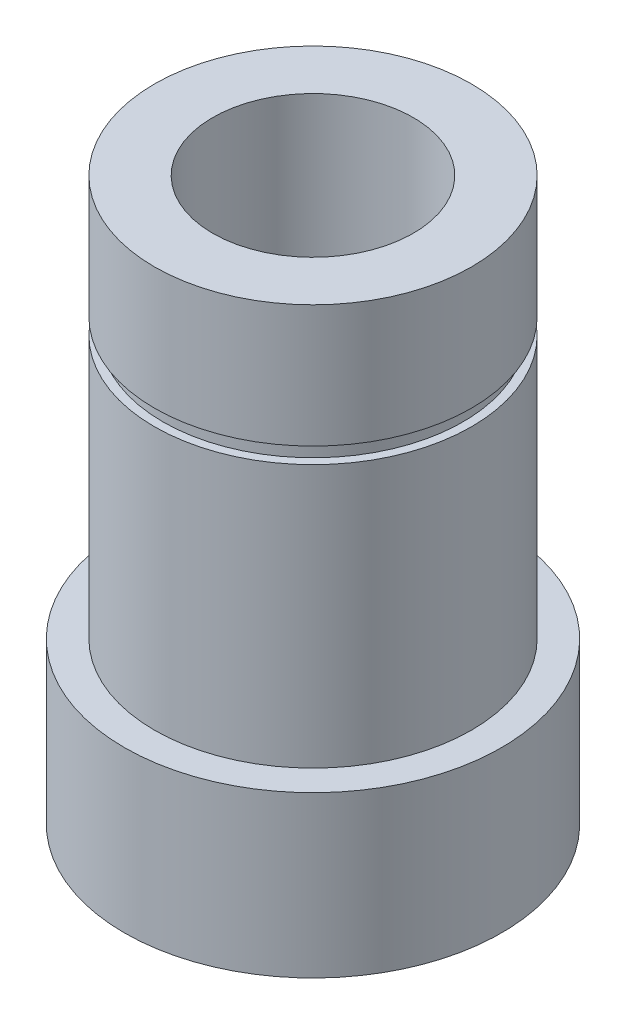
ISO-10303-21;
HEADER;
FILE_DESCRIPTION(('STEP AP214'),'2;1');
FILE_NAME('part.step','',(''),(''),'','','');
FILE_SCHEMA(('AUTOMOTIVE_DESIGN { 1 0 10303 214 1 1 1 1 }'));
ENDSEC;
DATA;
#1=APPLICATION_CONTEXT('core data for automotive mechanical design processes');
#2=APPLICATION_PROTOCOL_DEFINITION('international standard','automotive_design',2000,#1);
#3=PRODUCT_CONTEXT('',#1,'mechanical');
#4=PRODUCT('Part','Part','',(#3));
#5=PRODUCT_RELATED_PRODUCT_CATEGORY('part','',(#4));
#6=PRODUCT_DEFINITION_FORMATION('','',#4);
#7=PRODUCT_DEFINITION_CONTEXT('part definition',#1,'design');
#8=PRODUCT_DEFINITION('design','',#6,#7);
#9=PRODUCT_DEFINITION_SHAPE('','',#8);
#10=(LENGTH_UNIT() NAMED_UNIT(*) SI_UNIT(.MILLI.,.METRE.));
#11=(NAMED_UNIT(*) PLANE_ANGLE_UNIT() SI_UNIT($,.RADIAN.));
#12=(NAMED_UNIT(*) SI_UNIT($,.STERADIAN.) SOLID_ANGLE_UNIT());
#13=UNCERTAINTY_MEASURE_WITH_UNIT(LENGTH_MEASURE(1.E-05),#10,'distance_accuracy_value','');
#14=(GEOMETRIC_REPRESENTATION_CONTEXT(3) GLOBAL_UNCERTAINTY_ASSIGNED_CONTEXT((#13)) GLOBAL_UNIT_ASSIGNED_CONTEXT((#10,
#11,#12)) REPRESENTATION_CONTEXT('',''));
#15=CARTESIAN_POINT('',(0.,0.,0.));
#16=DIRECTION('',(0.,0.,1.));
#17=DIRECTION('',(1.,0.,0.));
#18=AXIS2_PLACEMENT_3D('',#15,#16,#17);
#19=CARTESIAN_POINT('',(0.,10.5,0.));
#20=DIRECTION('',(0.,-1.,0.));
#21=DIRECTION('',(0.,0.,-1.));
#22=AXIS2_PLACEMENT_3D('',#19,#20,#21);
#23=CYLINDRICAL_SURFACE('',#22,3.95);
#24=CARTESIAN_POINT('',(0.,4.,0.));
#25=DIRECTION('',(0.,1.,0.));
#26=DIRECTION('',(0.,0.,1.));
#27=AXIS2_PLACEMENT_3D('',#24,#25,#26);
#28=CIRCLE('',#27,3.95);
#29=CARTESIAN_POINT('',(0.,4.,-3.95));
#30=VERTEX_POINT('',#29);
#31=EDGE_CURVE('E45',#30,#30,#28,.T.);
#32=CARTESIAN_POINT('',(0.,10.55,0.));
#33=DIRECTION('',(0.,1.,0.));
#34=DIRECTION('',(0.,0.,1.));
#35=AXIS2_PLACEMENT_3D('',#32,#33,#34);
#36=CIRCLE('',#35,3.95);
#37=CARTESIAN_POINT('',(0.,10.55,-3.95));
#38=VERTEX_POINT('',#37);
#39=EDGE_CURVE('E49',#38,#38,#36,.T.);
#40=CARTESIAN_POINT('',(0.,4.,-3.95));
#41=CARTESIAN_POINT('',(0.,4.06822916666667,-3.95));
#42=CARTESIAN_POINT('',(0.,4.13645833333333,-3.95));
#43=CARTESIAN_POINT('',(0.,4.27291666666667,-3.95));
#44=CARTESIAN_POINT('',(0.,4.34114583333333,-3.95));
#45=CARTESIAN_POINT('',(0.,4.47760416666667,-3.95));
#46=CARTESIAN_POINT('',(0.,4.54583333333333,-3.95));
#47=CARTESIAN_POINT('',(0.,4.68229166666667,-3.95));
#48=CARTESIAN_POINT('',(0.,4.75052083333333,-3.95));
#49=CARTESIAN_POINT('',(0.,4.88697916666667,-3.95));
#50=CARTESIAN_POINT('',(0.,4.95520833333333,-3.95));
#51=CARTESIAN_POINT('',(0.,5.09166666666667,-3.95));
#52=CARTESIAN_POINT('',(0.,5.15989583333333,-3.95));
#53=CARTESIAN_POINT('',(0.,5.29635416666667,-3.95));
#54=CARTESIAN_POINT('',(0.,5.36458333333333,-3.95));
#55=CARTESIAN_POINT('',(0.,5.50104166666667,-3.95));
#56=CARTESIAN_POINT('',(0.,5.56927083333333,-3.95));
#57=CARTESIAN_POINT('',(0.,5.70572916666667,-3.95));
#58=CARTESIAN_POINT('',(0.,5.77395833333333,-3.95));
#59=CARTESIAN_POINT('',(0.,5.91041666666667,-3.95));
#60=CARTESIAN_POINT('',(0.,5.97864583333333,-3.95));
#61=CARTESIAN_POINT('',(0.,6.11510416666667,-3.95));
#62=CARTESIAN_POINT('',(0.,6.18333333333333,-3.95));
#63=CARTESIAN_POINT('',(0.,6.31979166666667,-3.95));
#64=CARTESIAN_POINT('',(0.,6.38802083333333,-3.95));
#65=CARTESIAN_POINT('',(0.,6.52447916666667,-3.95));
#66=CARTESIAN_POINT('',(0.,6.59270833333333,-3.95));
#67=CARTESIAN_POINT('',(0.,6.72916666666667,-3.95));
#68=CARTESIAN_POINT('',(0.,6.79739583333333,-3.95));
#69=CARTESIAN_POINT('',(0.,6.93385416666667,-3.95));
#70=CARTESIAN_POINT('',(0.,7.00208333333333,-3.95));
#71=CARTESIAN_POINT('',(0.,7.13854166666667,-3.95));
#72=CARTESIAN_POINT('',(0.,7.20677083333333,-3.95));
#73=CARTESIAN_POINT('',(0.,7.34322916666667,-3.95));
#74=CARTESIAN_POINT('',(0.,7.41145833333333,-3.95));
#75=CARTESIAN_POINT('',(0.,7.54791666666667,-3.95));
#76=CARTESIAN_POINT('',(0.,7.61614583333333,-3.95));
#77=CARTESIAN_POINT('',(0.,7.75260416666667,-3.95));
#78=CARTESIAN_POINT('',(0.,7.82083333333333,-3.95));
#79=CARTESIAN_POINT('',(0.,7.95729166666667,-3.95));
#80=CARTESIAN_POINT('',(0.,8.02552083333333,-3.95));
#81=CARTESIAN_POINT('',(0.,8.16197916666667,-3.95));
#82=CARTESIAN_POINT('',(0.,8.23020833333333,-3.95));
#83=CARTESIAN_POINT('',(0.,8.36666666666667,-3.95));
#84=CARTESIAN_POINT('',(0.,8.43489583333333,-3.95));
#85=CARTESIAN_POINT('',(0.,8.57135416666667,-3.95));
#86=CARTESIAN_POINT('',(0.,8.63958333333333,-3.95));
#87=CARTESIAN_POINT('',(0.,8.77604166666667,-3.95));
#88=CARTESIAN_POINT('',(0.,8.84427083333333,-3.95));
#89=CARTESIAN_POINT('',(0.,8.98072916666667,-3.95));
#90=CARTESIAN_POINT('',(0.,9.04895833333333,-3.95));
#91=CARTESIAN_POINT('',(0.,9.18541666666667,-3.95));
#92=CARTESIAN_POINT('',(0.,9.25364583333333,-3.95));
#93=CARTESIAN_POINT('',(0.,9.39010416666667,-3.95));
#94=CARTESIAN_POINT('',(0.,9.45833333333333,-3.95));
#95=CARTESIAN_POINT('',(0.,9.59479166666667,-3.95));
#96=CARTESIAN_POINT('',(0.,9.66302083333333,-3.95));
#97=CARTESIAN_POINT('',(0.,9.79947916666667,-3.95));
#98=CARTESIAN_POINT('',(0.,9.86770833333333,-3.95));
#99=CARTESIAN_POINT('',(0.,10.0041666666667,-3.95));
#100=CARTESIAN_POINT('',(0.,10.0723958333333,-3.95));
#101=CARTESIAN_POINT('',(0.,10.2088541666667,-3.95));
#102=CARTESIAN_POINT('',(0.,10.2770833333333,-3.95));
#103=CARTESIAN_POINT('',(0.,10.4135416666667,-3.95));
#104=CARTESIAN_POINT('',(0.,10.4817708333333,-3.95));
#105=CARTESIAN_POINT('',(0.,10.55,-3.95));
#106=B_SPLINE_CURVE_WITH_KNOTS('',3,(#40,#41,#42,#43,#44,#45,#46,#47,#48,#49,#50,#51,#52,#53,
#54,#55,#56,#57,#58,#59,#60,#61,#62,#63,#64,#65,#66,#67,#68,#69,#70,#71,#72,#73,#74,#75,#76,#77,
#78,#79,#80,#81,#82,#83,#84,#85,#86,#87,#88,#89,#90,#91,#92,#93,#94,#95,#96,#97,#98,#99,#100,
#101,#102,#103,#104,#105),.UNSPECIFIED.,.F.,.F.,(4,2,2,2,2,2,2,2,2,2,2,2,2,2,2,2,2,2,2,2,2,2,2,
2,2,2,2,2,2,2,2,2,4),(0.,0.2046875,0.409375,0.6140625,0.81875,1.0234375,1.228125,1.4328125,
1.6375,1.8421875,2.046875,2.2515625,2.45625,2.6609375,2.865625,3.0703125,3.275,3.4796875,
3.684375,3.8890625,4.09375,4.2984375,4.503125,4.7078125,4.9125,5.1171875,5.321875,5.5265625,
5.73125,5.9359375,6.140625,6.3453125,6.55),.UNSPECIFIED.);
#107=EDGE_CURVE('BSEAM32',#30,#38,#106,.T.);
#108=ORIENTED_EDGE('',*,*,#31,.T.);
#109=ORIENTED_EDGE('',*,*,#39,.F.);
#110=ORIENTED_EDGE('',*,*,#107,.T.);
#111=ORIENTED_EDGE('',*,*,#107,.F.);
#112=EDGE_LOOP('',(#108,#110,#109,#111));
#113=FACE_BOUND('',#112,.T.);
#114=ADVANCED_FACE('F32',(#113),#23,.T.);
#115=CARTESIAN_POINT('',(0.,4.,0.));
#116=DIRECTION('',(0.,-1.,0.));
#117=DIRECTION('',(0.,0.,-1.));
#118=AXIS2_PLACEMENT_3D('',#115,#116,#117);
#119=CYLINDRICAL_SURFACE('',#118,4.7);
#120=CARTESIAN_POINT('',(0.,4.,0.));
#121=DIRECTION('',(0.,1.,0.));
#122=DIRECTION('',(0.,0.,1.));
#123=AXIS2_PLACEMENT_3D('',#120,#121,#122);
#124=CIRCLE('',#123,4.7);
#125=CARTESIAN_POINT('',(0.,4.,4.7));
#126=VERTEX_POINT('',#125);
#127=EDGE_CURVE('E11',#126,#126,#124,.T.);
#128=ORIENTED_EDGE('',*,*,#127,.F.);
#129=EDGE_LOOP('',(#128));
#130=FACE_BOUND('',#129,.T.);
#131=CARTESIAN_POINT('',(0.,0.,0.));
#132=DIRECTION('',(0.,1.,0.));
#133=DIRECTION('',(0.,0.,1.));
#134=AXIS2_PLACEMENT_3D('',#131,#132,#133);
#135=CIRCLE('',#134,4.7);
#136=CARTESIAN_POINT('',(0.,0.,4.7));
#137=VERTEX_POINT('',#136);
#138=EDGE_CURVE('E40',#137,#137,#135,.T.);
#139=ORIENTED_EDGE('',*,*,#138,.T.);
#140=EDGE_LOOP('',(#139));
#141=FACE_BOUND('',#140,.T.);
#142=ADVANCED_FACE('F34',(#130,#141),#119,.T.);
#143=CARTESIAN_POINT('',(0.,4.,0.));
#144=DIRECTION('',(0.,1.,0.));
#145=DIRECTION('',(0.,0.,1.));
#146=AXIS2_PLACEMENT_3D('',#143,#144,#145);
#147=PLANE('',#146);
#148=ORIENTED_EDGE('',*,*,#31,.F.);
#149=EDGE_LOOP('',(#148));
#150=FACE_BOUND('',#149,.T.);
#151=ORIENTED_EDGE('',*,*,#127,.T.);
#152=EDGE_LOOP('',(#151));
#153=FACE_BOUND('',#152,.T.);
#154=ADVANCED_FACE('F77',(#150,#153),#147,.T.);
#155=CARTESIAN_POINT('',(0.,0.,0.));
#156=DIRECTION('',(0.,1.,0.));
#157=DIRECTION('',(0.,0.,1.));
#158=AXIS2_PLACEMENT_3D('',#155,#156,#157);
#159=PLANE('',#158);
#160=CARTESIAN_POINT('',(0.,0.,0.));
#161=DIRECTION('',(0.,1.,0.));
#162=DIRECTION('',(0.,0.,1.));
#163=AXIS2_PLACEMENT_3D('',#160,#161,#162);
#164=CIRCLE('',#163,2.5);
#165=CARTESIAN_POINT('',(0.,0.,2.5));
#166=VERTEX_POINT('',#165);
#167=EDGE_CURVE('E64',#166,#166,#164,.T.);
#168=ORIENTED_EDGE('',*,*,#167,.T.);
#169=EDGE_LOOP('',(#168));
#170=FACE_BOUND('',#169,.T.);
#171=ORIENTED_EDGE('',*,*,#138,.F.);
#172=EDGE_LOOP('',(#171));
#173=FACE_BOUND('',#172,.T.);
#174=ADVANCED_FACE('F79',(#170,#173),#159,.F.);
#175=CARTESIAN_POINT('',(0.,10.95,0.));
#176=DIRECTION('',(0.,1.,0.));
#177=DIRECTION('',(0.,0.,1.));
#178=AXIS2_PLACEMENT_3D('',#175,#176,#177);
#179=CIRCLE('',#178,3.95);
#180=CARTESIAN_POINT('',(0.,10.95,-3.95));
#181=VERTEX_POINT('',#180);
#182=EDGE_CURVE('E36',#181,#181,#179,.T.);
#183=CARTESIAN_POINT('',(0.,14.,0.));
#184=DIRECTION('',(0.,1.,0.));
#185=DIRECTION('',(0.,0.,1.));
#186=AXIS2_PLACEMENT_3D('',#183,#184,#185);
#187=CIRCLE('',#186,3.95);
#188=CARTESIAN_POINT('',(0.,14.,-3.95));
#189=VERTEX_POINT('',#188);
#190=EDGE_CURVE('E67',#189,#189,#187,.T.);
#191=CARTESIAN_POINT('',(0.,10.95,-3.95));
#192=CARTESIAN_POINT('',(0.,10.9817708333333,-3.95));
#193=CARTESIAN_POINT('',(0.,11.0135416666667,-3.95));
#194=CARTESIAN_POINT('',(0.,11.0770833333333,-3.95));
#195=CARTESIAN_POINT('',(0.,11.1088541666667,-3.95));
#196=CARTESIAN_POINT('',(0.,11.1723958333333,-3.95));
#197=CARTESIAN_POINT('',(0.,11.2041666666667,-3.95));
#198=CARTESIAN_POINT('',(0.,11.2677083333333,-3.95));
#199=CARTESIAN_POINT('',(0.,11.2994791666667,-3.95));
#200=CARTESIAN_POINT('',(0.,11.3630208333333,-3.95));
#201=CARTESIAN_POINT('',(0.,11.3947916666667,-3.95));
#202=CARTESIAN_POINT('',(0.,11.4583333333333,-3.95));
#203=CARTESIAN_POINT('',(0.,11.4901041666667,-3.95));
#204=CARTESIAN_POINT('',(0.,11.5536458333333,-3.95));
#205=CARTESIAN_POINT('',(0.,11.5854166666667,-3.95));
#206=CARTESIAN_POINT('',(0.,11.6489583333333,-3.95));
#207=CARTESIAN_POINT('',(0.,11.6807291666667,-3.95));
#208=CARTESIAN_POINT('',(0.,11.7442708333333,-3.95));
#209=CARTESIAN_POINT('',(0.,11.7760416666667,-3.95));
#210=CARTESIAN_POINT('',(0.,11.8395833333333,-3.95));
#211=CARTESIAN_POINT('',(0.,11.8713541666667,-3.95));
#212=CARTESIAN_POINT('',(0.,11.9348958333333,-3.95));
#213=CARTESIAN_POINT('',(0.,11.9666666666667,-3.95));
#214=CARTESIAN_POINT('',(0.,12.0302083333333,-3.95));
#215=CARTESIAN_POINT('',(0.,12.0619791666667,-3.95));
#216=CARTESIAN_POINT('',(0.,12.1255208333333,-3.95));
#217=CARTESIAN_POINT('',(0.,12.1572916666667,-3.95));
#218=CARTESIAN_POINT('',(0.,12.2208333333333,-3.95));
#219=CARTESIAN_POINT('',(0.,12.2526041666667,-3.95));
#220=CARTESIAN_POINT('',(0.,12.3161458333333,-3.95));
#221=CARTESIAN_POINT('',(0.,12.3479166666667,-3.95));
#222=CARTESIAN_POINT('',(0.,12.4114583333333,-3.95));
#223=CARTESIAN_POINT('',(0.,12.4432291666667,-3.95));
#224=CARTESIAN_POINT('',(0.,12.5067708333333,-3.95));
#225=CARTESIAN_POINT('',(0.,12.5385416666667,-3.95));
#226=CARTESIAN_POINT('',(0.,12.6020833333333,-3.95));
#227=CARTESIAN_POINT('',(0.,12.6338541666667,-3.95));
#228=CARTESIAN_POINT('',(0.,12.6973958333333,-3.95));
#229=CARTESIAN_POINT('',(0.,12.7291666666667,-3.95));
#230=CARTESIAN_POINT('',(0.,12.7927083333333,-3.95));
#231=CARTESIAN_POINT('',(0.,12.8244791666667,-3.95));
#232=CARTESIAN_POINT('',(0.,12.8880208333333,-3.95));
#233=CARTESIAN_POINT('',(0.,12.9197916666667,-3.95));
#234=CARTESIAN_POINT('',(0.,12.9833333333333,-3.95));
#235=CARTESIAN_POINT('',(0.,13.0151041666667,-3.95));
#236=CARTESIAN_POINT('',(0.,13.0786458333333,-3.95));
#237=CARTESIAN_POINT('',(0.,13.1104166666667,-3.95));
#238=CARTESIAN_POINT('',(0.,13.1739583333333,-3.95));
#239=CARTESIAN_POINT('',(0.,13.2057291666667,-3.95));
#240=CARTESIAN_POINT('',(0.,13.2692708333333,-3.95));
#241=CARTESIAN_POINT('',(0.,13.3010416666667,-3.95));
#242=CARTESIAN_POINT('',(0.,13.3645833333333,-3.95));
#243=CARTESIAN_POINT('',(0.,13.3963541666667,-3.95));
#244=CARTESIAN_POINT('',(0.,13.4598958333333,-3.95));
#245=CARTESIAN_POINT('',(0.,13.4916666666667,-3.95));
#246=CARTESIAN_POINT('',(0.,13.5552083333333,-3.95));
#247=CARTESIAN_POINT('',(0.,13.5869791666667,-3.95));
#248=CARTESIAN_POINT('',(0.,13.6505208333333,-3.95));
#249=CARTESIAN_POINT('',(0.,13.6822916666667,-3.95));
#250=CARTESIAN_POINT('',(0.,13.7458333333333,-3.95));
#251=CARTESIAN_POINT('',(0.,13.7776041666667,-3.95));
#252=CARTESIAN_POINT('',(0.,13.8411458333333,-3.95));
#253=CARTESIAN_POINT('',(0.,13.8729166666667,-3.95));
#254=CARTESIAN_POINT('',(0.,13.9364583333333,-3.95));
#255=CARTESIAN_POINT('',(0.,13.9682291666667,-3.95));
#256=CARTESIAN_POINT('',(0.,14.,-3.95));
#257=B_SPLINE_CURVE_WITH_KNOTS('',3,(#191,#192,#193,#194,#195,#196,#197,#198,#199,#200,#201,
#202,#203,#204,#205,#206,#207,#208,#209,#210,#211,#212,#213,#214,#215,#216,#217,#218,#219,#220,
#221,#222,#223,#224,#225,#226,#227,#228,#229,#230,#231,#232,#233,#234,#235,#236,#237,#238,#239,
#240,#241,#242,#243,#244,#245,#246,#247,#248,#249,#250,#251,#252,#253,#254,#255,#256),
.UNSPECIFIED.,.F.,.F.,(4,2,2,2,2,2,2,2,2,2,2,2,2,2,2,2,2,2,2,2,2,2,2,2,2,2,2,2,2,2,2,2,4),(0.,
0.0953125000000016,0.190625000000002,0.285937500000001,0.381250000000001,0.476562500000001,
0.571875000000001,0.667187500000001,0.762500000000001,0.857812500000001,0.953125000000001,
1.0484375,1.14375,1.2390625,1.334375,1.4296875,1.525,1.6203125,1.715625,1.8109375,1.90625,
2.0015625,2.096875,2.1921875,2.2875,2.3828125,2.478125,2.5734375,2.66875,2.7640625,2.859375,
2.9546875,3.05),.UNSPECIFIED.);
#258=EDGE_CURVE('BSEAM85',#181,#189,#257,.T.);
#259=ORIENTED_EDGE('',*,*,#182,.T.);
#260=ORIENTED_EDGE('',*,*,#190,.F.);
#261=ORIENTED_EDGE('',*,*,#258,.T.);
#262=ORIENTED_EDGE('',*,*,#258,.F.);
#263=EDGE_LOOP('',(#259,#261,#260,#262));
#264=FACE_BOUND('',#263,.T.);
#265=ADVANCED_FACE('F85',(#264),#23,.T.);
#266=CARTESIAN_POINT('',(0.,14.,0.));
#267=DIRECTION('',(0.,1.,0.));
#268=DIRECTION('',(0.,0.,1.));
#269=AXIS2_PLACEMENT_3D('',#266,#267,#268);
#270=PLANE('',#269);
#271=CARTESIAN_POINT('',(0.,14.,0.));
#272=DIRECTION('',(0.,1.,0.));
#273=DIRECTION('',(0.,0.,1.));
#274=AXIS2_PLACEMENT_3D('',#271,#272,#273);
#275=CIRCLE('',#274,2.5);
#276=CARTESIAN_POINT('',(0.,14.,2.5));
#277=VERTEX_POINT('',#276);
#278=EDGE_CURVE('E55',#277,#277,#275,.T.);
#279=ORIENTED_EDGE('',*,*,#278,.F.);
#280=EDGE_LOOP('',(#279));
#281=FACE_BOUND('',#280,.T.);
#282=ORIENTED_EDGE('',*,*,#190,.T.);
#283=EDGE_LOOP('',(#282));
#284=FACE_BOUND('',#283,.T.);
#285=ADVANCED_FACE('F95',(#281,#284),#270,.T.);
#286=CARTESIAN_POINT('',(0.,0.,0.));
#287=DIRECTION('',(0.,1.,0.));
#288=DIRECTION('',(0.,0.,1.));
#289=AXIS2_PLACEMENT_3D('',#286,#287,#288);
#290=CYLINDRICAL_SURFACE('',#289,2.5);
#291=ORIENTED_EDGE('',*,*,#167,.F.);
#292=EDGE_LOOP('',(#291));
#293=FACE_BOUND('',#292,.T.);
#294=ORIENTED_EDGE('',*,*,#278,.T.);
#295=EDGE_LOOP('',(#294));
#296=FACE_BOUND('',#295,.T.);
#297=ADVANCED_FACE('F101',(#293,#296),#290,.F.);
#298=CARTESIAN_POINT('',(0.,10.95,0.));
#299=DIRECTION('',(0.,1.,0.));
#300=DIRECTION('',(0.,0.,1.));
#301=AXIS2_PLACEMENT_3D('',#298,#299,#300);
#302=PLANE('',#301);
#303=CARTESIAN_POINT('',(0.,10.95,0.));
#304=DIRECTION('',(0.,1.,0.));
#305=DIRECTION('',(0.,0.,1.));
#306=AXIS2_PLACEMENT_3D('',#303,#304,#305);
#307=CIRCLE('',#306,3.74);
#308=CARTESIAN_POINT('',(0.,10.95,3.74));
#309=VERTEX_POINT('',#308);
#310=EDGE_CURVE('E51',#309,#309,#307,.T.);
#311=ORIENTED_EDGE('',*,*,#310,.T.);
#312=EDGE_LOOP('',(#311));
#313=FACE_BOUND('',#312,.T.);
#314=ORIENTED_EDGE('',*,*,#182,.F.);
#315=EDGE_LOOP('',(#314));
#316=FACE_BOUND('',#315,.T.);
#317=ADVANCED_FACE('F106',(#313,#316),#302,.F.);
#318=CARTESIAN_POINT('',(0.,10.55,0.));
#319=DIRECTION('',(0.,1.,0.));
#320=DIRECTION('',(0.,0.,1.));
#321=AXIS2_PLACEMENT_3D('',#318,#319,#320);
#322=PLANE('',#321);
#323=CARTESIAN_POINT('',(0.,10.55,0.));
#324=DIRECTION('',(0.,1.,0.));
#325=DIRECTION('',(0.,0.,1.));
#326=AXIS2_PLACEMENT_3D('',#323,#324,#325);
#327=CIRCLE('',#326,3.74);
#328=CARTESIAN_POINT('',(0.,10.55,3.74));
#329=VERTEX_POINT('',#328);
#330=EDGE_CURVE('E57',#329,#329,#327,.T.);
#331=ORIENTED_EDGE('',*,*,#330,.F.);
#332=EDGE_LOOP('',(#331));
#333=FACE_BOUND('',#332,.T.);
#334=ORIENTED_EDGE('',*,*,#39,.T.);
#335=EDGE_LOOP('',(#334));
#336=FACE_BOUND('',#335,.T.);
#337=ADVANCED_FACE('F108',(#333,#336),#322,.T.);
#338=CARTESIAN_POINT('',(0.,10.95,0.));
#339=DIRECTION('',(0.,-1.,0.));
#340=DIRECTION('',(0.,0.,-1.));
#341=AXIS2_PLACEMENT_3D('',#338,#339,#340);
#342=CYLINDRICAL_SURFACE('',#341,3.74);
#343=ORIENTED_EDGE('',*,*,#310,.F.);
#344=EDGE_LOOP('',(#343));
#345=FACE_BOUND('',#344,.T.);
#346=ORIENTED_EDGE('',*,*,#330,.T.);
#347=EDGE_LOOP('',(#346));
#348=FACE_BOUND('',#347,.T.);
#349=ADVANCED_FACE('F113',(#345,#348),#342,.T.);
#350=CLOSED_SHELL('',(#114,#142,#154,#174,#265,#285,#297,#317,#337,#349));
#351=MANIFOLD_SOLID_BREP('B2',#350);
#352=ADVANCED_BREP_SHAPE_REPRESENTATION('',(#18,#351),#14);
#353=SHAPE_DEFINITION_REPRESENTATION(#9,#352);
ENDSEC;
END-ISO-10303-21;
